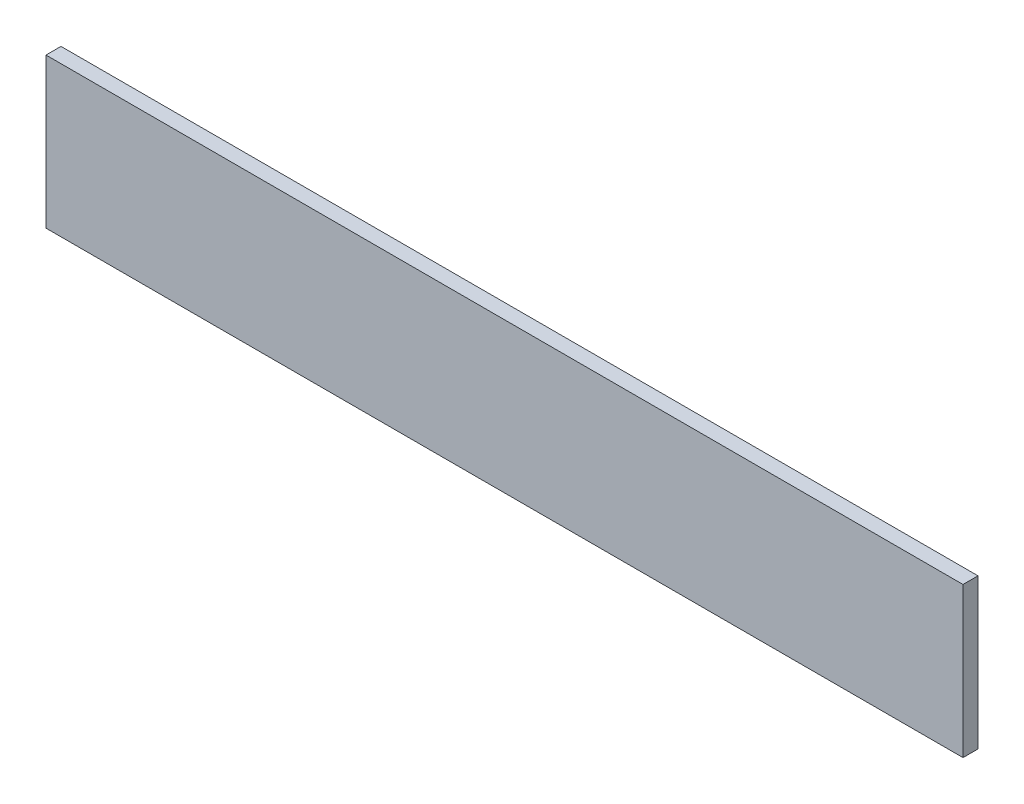
ISO-10303-21;
HEADER;
FILE_DESCRIPTION(('STEP AP214'),'2;1');
FILE_NAME('part.step','',(''),(''),'','','');
FILE_SCHEMA(('AUTOMOTIVE_DESIGN { 1 0 10303 214 1 1 1 1 }'));
ENDSEC;
DATA;
#1=APPLICATION_CONTEXT('core data for automotive mechanical design processes');
#2=APPLICATION_PROTOCOL_DEFINITION('international standard','automotive_design',2000,#1);
#3=PRODUCT_CONTEXT('',#1,'mechanical');
#4=PRODUCT('Part','Part','',(#3));
#5=PRODUCT_RELATED_PRODUCT_CATEGORY('part','',(#4));
#6=PRODUCT_DEFINITION_FORMATION('','',#4);
#7=PRODUCT_DEFINITION_CONTEXT('part definition',#1,'design');
#8=PRODUCT_DEFINITION('design','',#6,#7);
#9=PRODUCT_DEFINITION_SHAPE('','',#8);
#10=(LENGTH_UNIT() NAMED_UNIT(*) SI_UNIT(.MILLI.,.METRE.));
#11=(NAMED_UNIT(*) PLANE_ANGLE_UNIT() SI_UNIT($,.RADIAN.));
#12=(NAMED_UNIT(*) SI_UNIT($,.STERADIAN.) SOLID_ANGLE_UNIT());
#13=UNCERTAINTY_MEASURE_WITH_UNIT(LENGTH_MEASURE(1.E-05),#10,'distance_accuracy_value','');
#14=(GEOMETRIC_REPRESENTATION_CONTEXT(3) GLOBAL_UNCERTAINTY_ASSIGNED_CONTEXT((#13)) GLOBAL_UNIT_ASSIGNED_CONTEXT((#10,
#11,#12)) REPRESENTATION_CONTEXT('',''));
#15=CARTESIAN_POINT('',(0.,0.,0.));
#16=DIRECTION('',(0.,0.,1.));
#17=DIRECTION('',(1.,0.,0.));
#18=AXIS2_PLACEMENT_3D('',#15,#16,#17);
#19=CARTESIAN_POINT('',(0.,0.,100.));
#20=DIRECTION('',(1.,0.,0.));
#21=DIRECTION('',(0.,0.,-1.));
#22=AXIS2_PLACEMENT_3D('',#19,#20,#21);
#23=PLANE('',#22);
#24=DIRECTION('',(0.,-1.,0.));
#25=VECTOR('',#24,1.);
#26=CARTESIAN_POINT('',(0.,0.,0.));
#27=LINE('',#26,#25);
#28=CARTESIAN_POINT('',(0.,0.,0.));
#29=VERTEX_POINT('',#28);
#30=CARTESIAN_POINT('',(0.,-1000.,0.));
#31=VERTEX_POINT('',#30);
#32=EDGE_CURVE('E100',#29,#31,#27,.T.);
#33=ORIENTED_EDGE('',*,*,#32,.T.);
#34=DIRECTION('',(0.,0.,-1.));
#35=VECTOR('',#34,1.);
#36=CARTESIAN_POINT('',(0.,-1000.,100.));
#37=LINE('',#36,#35);
#38=CARTESIAN_POINT('',(0.,-1000.,100.));
#39=VERTEX_POINT('',#38);
#40=EDGE_CURVE('E11',#39,#31,#37,.T.);
#41=ORIENTED_EDGE('',*,*,#40,.F.);
#42=DIRECTION('',(0.,-1.,0.));
#43=VECTOR('',#42,1.);
#44=CARTESIAN_POINT('',(0.,0.,100.));
#45=LINE('',#44,#43);
#46=CARTESIAN_POINT('',(0.,0.,100.));
#47=VERTEX_POINT('',#46);
#48=EDGE_CURVE('E88',#47,#39,#45,.T.);
#49=ORIENTED_EDGE('',*,*,#48,.F.);
#50=DIRECTION('',(0.,0.,-1.));
#51=VECTOR('',#50,1.);
#52=CARTESIAN_POINT('',(0.,0.,100.));
#53=LINE('',#52,#51);
#54=EDGE_CURVE('E96',#47,#29,#53,.T.);
#55=ORIENTED_EDGE('',*,*,#54,.T.);
#56=EDGE_LOOP('',(#33,#41,#49,#55));
#57=FACE_BOUND('',#56,.T.);
#58=ADVANCED_FACE('F37',(#57),#23,.F.);
#59=CARTESIAN_POINT('',(0.,-1000.,100.));
#60=DIRECTION('',(0.,1.,0.));
#61=DIRECTION('',(0.,0.,1.));
#62=AXIS2_PLACEMENT_3D('',#59,#60,#61);
#63=PLANE('',#62);
#64=DIRECTION('',(1.,0.,0.));
#65=VECTOR('',#64,1.);
#66=CARTESIAN_POINT('',(0.,-1000.,0.));
#67=LINE('',#66,#65);
#68=CARTESIAN_POINT('',(6115.,-1000.,0.));
#69=VERTEX_POINT('',#68);
#70=EDGE_CURVE('E92',#31,#69,#67,.T.);
#71=ORIENTED_EDGE('',*,*,#70,.T.);
#72=DIRECTION('',(0.,0.,-1.));
#73=VECTOR('',#72,1.);
#74=CARTESIAN_POINT('',(6115.,-1000.,100.));
#75=LINE('',#74,#73);
#76=CARTESIAN_POINT('',(6115.,-1000.,100.));
#77=VERTEX_POINT('',#76);
#78=EDGE_CURVE('E45',#77,#69,#75,.T.);
#79=ORIENTED_EDGE('',*,*,#78,.F.);
#80=DIRECTION('',(1.,0.,0.));
#81=VECTOR('',#80,1.);
#82=CARTESIAN_POINT('',(0.,-1000.,100.));
#83=LINE('',#82,#81);
#84=EDGE_CURVE('E83',#39,#77,#83,.T.);
#85=ORIENTED_EDGE('',*,*,#84,.F.);
#86=ORIENTED_EDGE('',*,*,#40,.T.);
#87=EDGE_LOOP('',(#71,#79,#85,#86));
#88=FACE_BOUND('',#87,.T.);
#89=ADVANCED_FACE('F91',(#88),#63,.F.);
#90=CARTESIAN_POINT('',(6115.,0.,100.));
#91=DIRECTION('',(-1.,0.,0.));
#92=DIRECTION('',(0.,0.,1.));
#93=AXIS2_PLACEMENT_3D('',#90,#91,#92);
#94=PLANE('',#93);
#95=DIRECTION('',(0.,1.,0.));
#96=VECTOR('',#95,1.);
#97=CARTESIAN_POINT('',(6115.,0.,0.));
#98=LINE('',#97,#96);
#99=CARTESIAN_POINT('',(6115.,0.,0.));
#100=VERTEX_POINT('',#99);
#101=EDGE_CURVE('E70',#69,#100,#98,.T.);
#102=ORIENTED_EDGE('',*,*,#101,.T.);
#103=DIRECTION('',(0.,0.,-1.));
#104=VECTOR('',#103,1.);
#105=CARTESIAN_POINT('',(6115.,0.,100.));
#106=LINE('',#105,#104);
#107=CARTESIAN_POINT('',(6115.,0.,100.));
#108=VERTEX_POINT('',#107);
#109=EDGE_CURVE('E93',#108,#100,#106,.T.);
#110=ORIENTED_EDGE('',*,*,#109,.F.);
#111=DIRECTION('',(0.,1.,0.));
#112=VECTOR('',#111,1.);
#113=CARTESIAN_POINT('',(6115.,0.,100.));
#114=LINE('',#113,#112);
#115=EDGE_CURVE('E86',#77,#108,#114,.T.);
#116=ORIENTED_EDGE('',*,*,#115,.F.);
#117=ORIENTED_EDGE('',*,*,#78,.T.);
#118=EDGE_LOOP('',(#102,#110,#116,#117));
#119=FACE_BOUND('',#118,.T.);
#120=ADVANCED_FACE('F94',(#119),#94,.F.);
#121=CARTESIAN_POINT('',(0.,0.,100.));
#122=DIRECTION('',(0.,-1.,0.));
#123=DIRECTION('',(0.,0.,-1.));
#124=AXIS2_PLACEMENT_3D('',#121,#122,#123);
#125=PLANE('',#124);
#126=DIRECTION('',(-1.,0.,0.));
#127=VECTOR('',#126,1.);
#128=CARTESIAN_POINT('',(0.,0.,0.));
#129=LINE('',#128,#127);
#130=EDGE_CURVE('E76',#100,#29,#129,.T.);
#131=ORIENTED_EDGE('',*,*,#130,.T.);
#132=ORIENTED_EDGE('',*,*,#54,.F.);
#133=DIRECTION('',(-1.,0.,0.));
#134=VECTOR('',#133,1.);
#135=CARTESIAN_POINT('',(0.,0.,100.));
#136=LINE('',#135,#134);
#137=EDGE_CURVE('E53',#108,#47,#136,.T.);
#138=ORIENTED_EDGE('',*,*,#137,.F.);
#139=ORIENTED_EDGE('',*,*,#109,.T.);
#140=EDGE_LOOP('',(#131,#132,#138,#139));
#141=FACE_BOUND('',#140,.T.);
#142=ADVANCED_FACE('F107',(#141),#125,.F.);
#143=CARTESIAN_POINT('',(0.,0.,100.));
#144=DIRECTION('',(0.,0.,1.));
#145=DIRECTION('',(1.,0.,0.));
#146=AXIS2_PLACEMENT_3D('',#143,#144,#145);
#147=PLANE('',#146);
#148=ORIENTED_EDGE('',*,*,#48,.T.);
#149=ORIENTED_EDGE('',*,*,#84,.T.);
#150=ORIENTED_EDGE('',*,*,#115,.T.);
#151=ORIENTED_EDGE('',*,*,#137,.T.);
#152=EDGE_LOOP('',(#148,#149,#150,#151));
#153=FACE_BOUND('',#152,.T.);
#154=ADVANCED_FACE('F84',(#153),#147,.T.);
#155=CARTESIAN_POINT('',(0.,0.,0.));
#156=DIRECTION('',(0.,0.,1.));
#157=DIRECTION('',(1.,0.,0.));
#158=AXIS2_PLACEMENT_3D('',#155,#156,#157);
#159=PLANE('',#158);
#160=ORIENTED_EDGE('',*,*,#32,.F.);
#161=ORIENTED_EDGE('',*,*,#130,.F.);
#162=ORIENTED_EDGE('',*,*,#101,.F.);
#163=ORIENTED_EDGE('',*,*,#70,.F.);
#164=EDGE_LOOP('',(#160,#161,#162,#163));
#165=FACE_BOUND('',#164,.T.);
#166=ADVANCED_FACE('F110',(#165),#159,.F.);
#167=CLOSED_SHELL('',(#58,#89,#120,#142,#154,#166));
#168=MANIFOLD_SOLID_BREP('B2',#167);
#169=ADVANCED_BREP_SHAPE_REPRESENTATION('',(#18,#168),#14);
#170=SHAPE_DEFINITION_REPRESENTATION(#9,#169);
ENDSEC;
END-ISO-10303-21;
